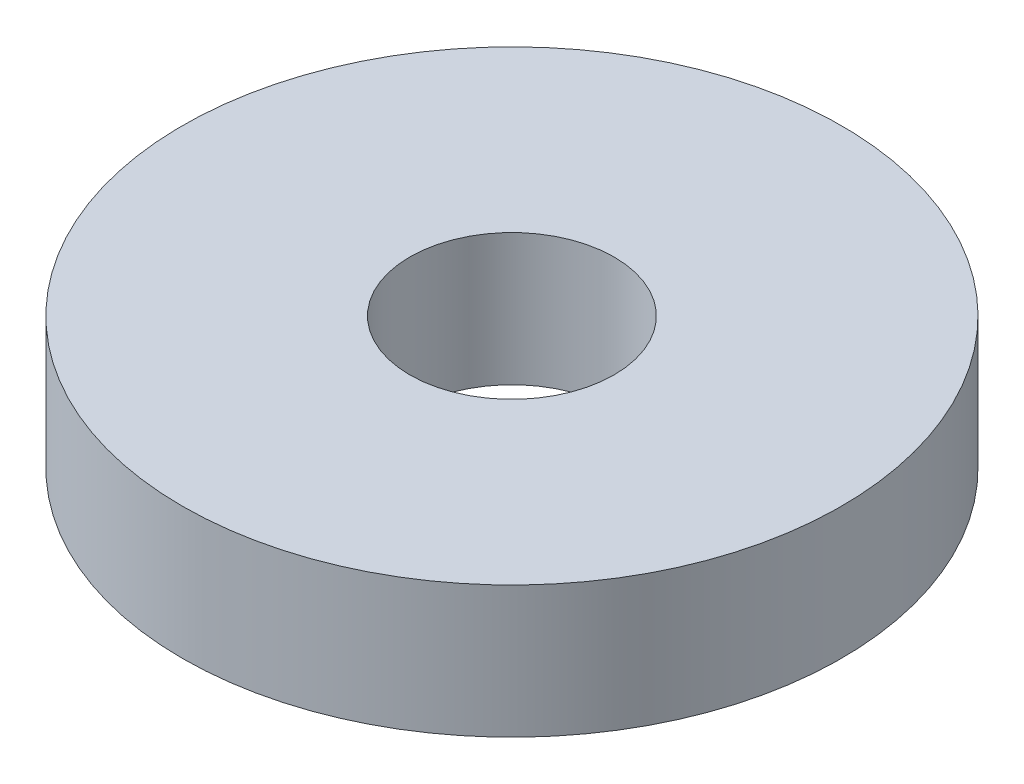
ISO-10303-21;
HEADER;
FILE_DESCRIPTION(('STEP AP214'),'2;1');
FILE_NAME('part.step','',(''),(''),'','','');
FILE_SCHEMA(('AUTOMOTIVE_DESIGN { 1 0 10303 214 1 1 1 1 }'));
ENDSEC;
DATA;
#1=APPLICATION_CONTEXT('core data for automotive mechanical design processes');
#2=APPLICATION_PROTOCOL_DEFINITION('international standard','automotive_design',2000,#1);
#3=PRODUCT_CONTEXT('',#1,'mechanical');
#4=PRODUCT('Part','Part','',(#3));
#5=PRODUCT_RELATED_PRODUCT_CATEGORY('part','',(#4));
#6=PRODUCT_DEFINITION_FORMATION('','',#4);
#7=PRODUCT_DEFINITION_CONTEXT('part definition',#1,'design');
#8=PRODUCT_DEFINITION('design','',#6,#7);
#9=PRODUCT_DEFINITION_SHAPE('','',#8);
#10=(LENGTH_UNIT() NAMED_UNIT(*) SI_UNIT(.MILLI.,.METRE.));
#11=(NAMED_UNIT(*) PLANE_ANGLE_UNIT() SI_UNIT($,.RADIAN.));
#12=(NAMED_UNIT(*) SI_UNIT($,.STERADIAN.) SOLID_ANGLE_UNIT());
#13=UNCERTAINTY_MEASURE_WITH_UNIT(LENGTH_MEASURE(1.E-05),#10,'distance_accuracy_value','');
#14=(GEOMETRIC_REPRESENTATION_CONTEXT(3) GLOBAL_UNCERTAINTY_ASSIGNED_CONTEXT((#13)) GLOBAL_UNIT_ASSIGNED_CONTEXT((#10,
#11,#12)) REPRESENTATION_CONTEXT('',''));
#15=CARTESIAN_POINT('',(0.,0.,0.));
#16=DIRECTION('',(0.,0.,1.));
#17=DIRECTION('',(1.,0.,0.));
#18=AXIS2_PLACEMENT_3D('',#15,#16,#17);
#19=CARTESIAN_POINT('',(0.,2.,0.));
#20=DIRECTION('',(0.,1.,0.));
#21=DIRECTION('',(0.,0.,1.));
#22=AXIS2_PLACEMENT_3D('',#19,#20,#21);
#23=PLANE('',#22);
#24=CARTESIAN_POINT('',(0.,2.,0.));
#25=DIRECTION('',(0.,1.,0.));
#26=DIRECTION('',(0.,0.,1.));
#27=AXIS2_PLACEMENT_3D('',#24,#25,#26);
#28=CIRCLE('',#27,5.);
#29=CARTESIAN_POINT('',(0.,2.,5.));
#30=VERTEX_POINT('',#29);
#31=EDGE_CURVE('E10',#30,#30,#28,.T.);
#32=ORIENTED_EDGE('',*,*,#31,.T.);
#33=EDGE_LOOP('',(#32));
#34=FACE_BOUND('',#33,.T.);
#35=CARTESIAN_POINT('',(0.,2.,0.));
#36=DIRECTION('',(0.,1.,0.));
#37=DIRECTION('',(0.,0.,1.));
#38=AXIS2_PLACEMENT_3D('',#35,#36,#37);
#39=CIRCLE('',#38,1.55);
#40=CARTESIAN_POINT('',(0.,2.,1.55));
#41=VERTEX_POINT('',#40);
#42=EDGE_CURVE('E56',#41,#41,#39,.T.);
#43=ORIENTED_EDGE('',*,*,#42,.F.);
#44=EDGE_LOOP('',(#43));
#45=FACE_BOUND('',#44,.T.);
#46=ADVANCED_FACE('F43',(#34,#45),#23,.T.);
#47=CARTESIAN_POINT('',(0.,0.,0.));
#48=DIRECTION('',(0.,1.,0.));
#49=DIRECTION('',(0.,0.,1.));
#50=AXIS2_PLACEMENT_3D('',#47,#48,#49);
#51=PLANE('',#50);
#52=CARTESIAN_POINT('',(0.,0.,0.));
#53=DIRECTION('',(0.,1.,0.));
#54=DIRECTION('',(0.,0.,1.));
#55=AXIS2_PLACEMENT_3D('',#52,#53,#54);
#56=CIRCLE('',#55,5.);
#57=CARTESIAN_POINT('',(0.,0.,5.));
#58=VERTEX_POINT('',#57);
#59=EDGE_CURVE('E47',#58,#58,#56,.T.);
#60=ORIENTED_EDGE('',*,*,#59,.F.);
#61=EDGE_LOOP('',(#60));
#62=FACE_BOUND('',#61,.T.);
#63=CARTESIAN_POINT('',(0.,0.,0.));
#64=DIRECTION('',(0.,1.,0.));
#65=DIRECTION('',(0.,0.,1.));
#66=AXIS2_PLACEMENT_3D('',#63,#64,#65);
#67=CIRCLE('',#66,1.55);
#68=CARTESIAN_POINT('',(0.,0.,1.55));
#69=VERTEX_POINT('',#68);
#70=EDGE_CURVE('E58',#69,#69,#67,.T.);
#71=ORIENTED_EDGE('',*,*,#70,.T.);
#72=EDGE_LOOP('',(#71));
#73=FACE_BOUND('',#72,.T.);
#74=ADVANCED_FACE('F70',(#62,#73),#51,.F.);
#75=CARTESIAN_POINT('',(0.,2.,0.));
#76=DIRECTION('',(0.,-1.,0.));
#77=DIRECTION('',(0.,0.,-1.));
#78=AXIS2_PLACEMENT_3D('',#75,#76,#77);
#79=CYLINDRICAL_SURFACE('',#78,5.);
#80=ORIENTED_EDGE('',*,*,#31,.F.);
#81=EDGE_LOOP('',(#80));
#82=FACE_BOUND('',#81,.T.);
#83=ORIENTED_EDGE('',*,*,#59,.T.);
#84=EDGE_LOOP('',(#83));
#85=FACE_BOUND('',#84,.T.);
#86=ADVANCED_FACE('F45',(#82,#85),#79,.T.);
#87=CARTESIAN_POINT('',(0.,2.,0.));
#88=DIRECTION('',(0.,-1.,0.));
#89=DIRECTION('',(0.,0.,-1.));
#90=AXIS2_PLACEMENT_3D('',#87,#88,#89);
#91=CYLINDRICAL_SURFACE('',#90,1.55);
#92=ORIENTED_EDGE('',*,*,#42,.T.);
#93=EDGE_LOOP('',(#92));
#94=FACE_BOUND('',#93,.T.);
#95=ORIENTED_EDGE('',*,*,#70,.F.);
#96=EDGE_LOOP('',(#95));
#97=FACE_BOUND('',#96,.T.);
#98=ADVANCED_FACE('F66',(#94,#97),#91,.F.);
#99=CLOSED_SHELL('',(#46,#74,#86,#98));
#100=MANIFOLD_SOLID_BREP('B2',#99);
#101=ADVANCED_BREP_SHAPE_REPRESENTATION('',(#18,#100),#14);
#102=SHAPE_DEFINITION_REPRESENTATION(#9,#101);
ENDSEC;
END-ISO-10303-21;
